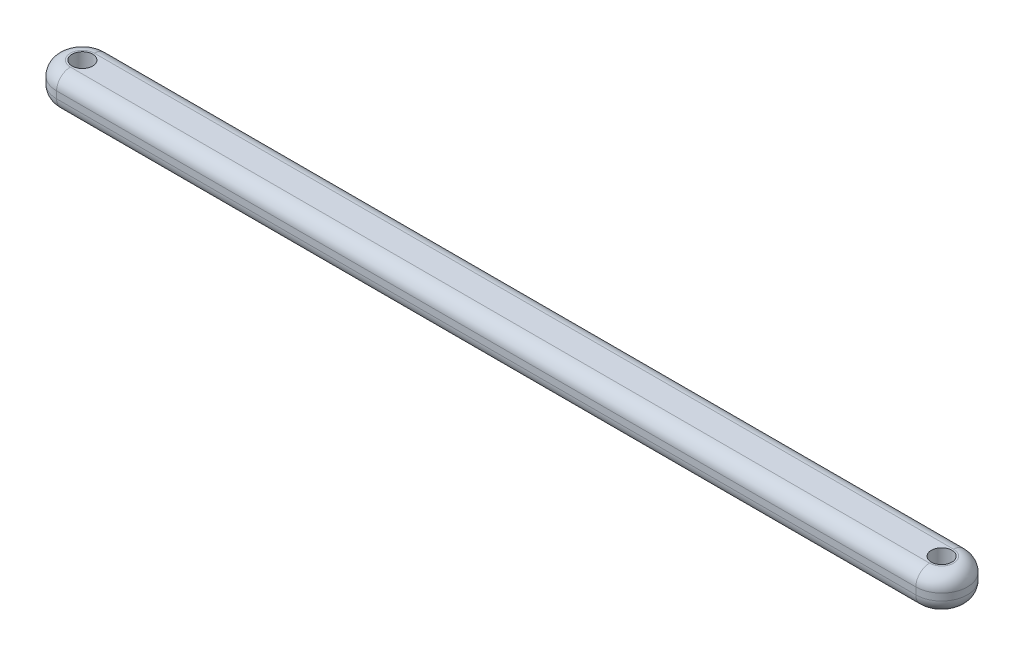
ISO-10303-21;
HEADER;
FILE_DESCRIPTION(('STEP AP214'),'2;1');
FILE_NAME('part.step','',(''),(''),'','','');
FILE_SCHEMA(('AUTOMOTIVE_DESIGN { 1 0 10303 214 1 1 1 1 }'));
ENDSEC;
DATA;
#1=APPLICATION_CONTEXT('core data for automotive mechanical design processes');
#2=APPLICATION_PROTOCOL_DEFINITION('international standard','automotive_design',2000,#1);
#3=PRODUCT_CONTEXT('',#1,'mechanical');
#4=PRODUCT('Part','Part','',(#3));
#5=PRODUCT_RELATED_PRODUCT_CATEGORY('part','',(#4));
#6=PRODUCT_DEFINITION_FORMATION('','',#4);
#7=PRODUCT_DEFINITION_CONTEXT('part definition',#1,'design');
#8=PRODUCT_DEFINITION('design','',#6,#7);
#9=PRODUCT_DEFINITION_SHAPE('','',#8);
#10=(LENGTH_UNIT() NAMED_UNIT(*) SI_UNIT(.MILLI.,.METRE.));
#11=(NAMED_UNIT(*) PLANE_ANGLE_UNIT() SI_UNIT($,.RADIAN.));
#12=(NAMED_UNIT(*) SI_UNIT($,.STERADIAN.) SOLID_ANGLE_UNIT());
#13=UNCERTAINTY_MEASURE_WITH_UNIT(LENGTH_MEASURE(1.E-05),#10,'distance_accuracy_value','');
#14=(GEOMETRIC_REPRESENTATION_CONTEXT(3) GLOBAL_UNCERTAINTY_ASSIGNED_CONTEXT((#13)) GLOBAL_UNIT_ASSIGNED_CONTEXT((#10,
#11,#12)) REPRESENTATION_CONTEXT('',''));
#15=CARTESIAN_POINT('',(0.,0.,0.));
#16=DIRECTION('',(0.,0.,1.));
#17=DIRECTION('',(1.,0.,0.));
#18=AXIS2_PLACEMENT_3D('',#15,#16,#17);
#19=CARTESIAN_POINT('',(-250.,5.,0.));
#20=DIRECTION('',(0.,1.,0.));
#21=DIRECTION('',(0.,0.,1.));
#22=AXIS2_PLACEMENT_3D('',#19,#20,#21);
#23=PLANE('',#22);
#24=DIRECTION('',(1.,0.,0.));
#25=VECTOR('',#24,1.);
#26=CARTESIAN_POINT('',(0.,5.,3.5));
#27=LINE('',#26,#25);
#28=CARTESIAN_POINT('',(-250.,5.,3.5));
#29=VERTEX_POINT('',#28);
#30=CARTESIAN_POINT('',(0.,5.,3.5));
#31=VERTEX_POINT('',#30);
#32=EDGE_CURVE('E131',#29,#31,#27,.T.);
#33=ORIENTED_EDGE('',*,*,#32,.T.);
#34=CARTESIAN_POINT('',(0.,5.,0.));
#35=DIRECTION('',(0.,1.,0.));
#36=DIRECTION('',(0.,0.,1.));
#37=AXIS2_PLACEMENT_3D('',#34,#35,#36);
#38=CIRCLE('',#37,3.5);
#39=CARTESIAN_POINT('',(0.,5.,-3.5));
#40=VERTEX_POINT('',#39);
#41=EDGE_CURVE('E112',#31,#40,#38,.T.);
#42=ORIENTED_EDGE('',*,*,#41,.T.);
#43=DIRECTION('',(-1.,0.,0.));
#44=VECTOR('',#43,1.);
#45=CARTESIAN_POINT('',(-250.,5.,-3.5));
#46=LINE('',#45,#44);
#47=CARTESIAN_POINT('',(-250.,5.,-3.5));
#48=VERTEX_POINT('',#47);
#49=EDGE_CURVE('E120',#40,#48,#46,.T.);
#50=ORIENTED_EDGE('',*,*,#49,.T.);
#51=CARTESIAN_POINT('',(-250.,5.,0.));
#52=DIRECTION('',(0.,1.,0.));
#53=DIRECTION('',(0.,0.,1.));
#54=AXIS2_PLACEMENT_3D('',#51,#52,#53);
#55=CIRCLE('',#54,3.5);
#56=EDGE_CURVE('E126',#48,#29,#55,.T.);
#57=ORIENTED_EDGE('',*,*,#56,.T.);
#58=EDGE_LOOP('',(#33,#42,#50,#57));
#59=FACE_BOUND('',#58,.T.);
#60=CARTESIAN_POINT('',(0.,5.,0.));
#61=DIRECTION('',(0.,1.,0.));
#62=DIRECTION('',(0.,0.,1.));
#63=AXIS2_PLACEMENT_3D('',#60,#61,#62);
#64=CIRCLE('',#63,3.);
#65=CARTESIAN_POINT('',(0.,5.,3.));
#66=VERTEX_POINT('',#65);
#67=EDGE_CURVE('E198',#66,#66,#64,.T.);
#68=ORIENTED_EDGE('',*,*,#67,.F.);
#69=EDGE_LOOP('',(#68));
#70=FACE_BOUND('',#69,.T.);
#71=CARTESIAN_POINT('',(-250.,5.,0.));
#72=DIRECTION('',(0.,1.,0.));
#73=DIRECTION('',(0.,0.,1.));
#74=AXIS2_PLACEMENT_3D('',#71,#72,#73);
#75=CIRCLE('',#74,2.99999999999999);
#76=CARTESIAN_POINT('',(-250.,5.,2.99999999999999));
#77=VERTEX_POINT('',#76);
#78=EDGE_CURVE('E351',#77,#77,#75,.T.);
#79=ORIENTED_EDGE('',*,*,#78,.F.);
#80=EDGE_LOOP('',(#79));
#81=FACE_BOUND('',#80,.T.);
#82=ADVANCED_FACE('F39',(#59,#70,#81),#23,.T.);
#83=CARTESIAN_POINT('',(-250.,-5.,0.));
#84=DIRECTION('',(0.,1.,0.));
#85=DIRECTION('',(0.,0.,1.));
#86=AXIS2_PLACEMENT_3D('',#83,#84,#85);
#87=PLANE('',#86);
#88=DIRECTION('',(-1.,0.,0.));
#89=VECTOR('',#88,1.);
#90=CARTESIAN_POINT('',(-250.,-5.,-3.5));
#91=LINE('',#90,#89);
#92=CARTESIAN_POINT('',(-250.,-5.,-3.5));
#93=VERTEX_POINT('',#92);
#94=CARTESIAN_POINT('',(0.,-5.,-3.5));
#95=VERTEX_POINT('',#94);
#96=EDGE_CURVE('E149',#93,#95,#91,.F.);
#97=ORIENTED_EDGE('',*,*,#96,.T.);
#98=CARTESIAN_POINT('',(0.,-5.,0.));
#99=DIRECTION('',(0.,1.,0.));
#100=DIRECTION('',(0.,0.,1.));
#101=AXIS2_PLACEMENT_3D('',#98,#99,#100);
#102=CIRCLE('',#101,3.5);
#103=CARTESIAN_POINT('',(0.,-5.,3.5));
#104=VERTEX_POINT('',#103);
#105=EDGE_CURVE('E154',#95,#104,#102,.F.);
#106=ORIENTED_EDGE('',*,*,#105,.T.);
#107=DIRECTION('',(1.,0.,0.));
#108=VECTOR('',#107,1.);
#109=CARTESIAN_POINT('',(-250.,-5.,3.5));
#110=LINE('',#109,#108);
#111=CARTESIAN_POINT('',(-250.,-5.,3.5));
#112=VERTEX_POINT('',#111);
#113=EDGE_CURVE('E63',#104,#112,#110,.F.);
#114=ORIENTED_EDGE('',*,*,#113,.T.);
#115=CARTESIAN_POINT('',(-250.,-5.,0.));
#116=DIRECTION('',(0.,1.,0.));
#117=DIRECTION('',(0.,0.,1.));
#118=AXIS2_PLACEMENT_3D('',#115,#116,#117);
#119=CIRCLE('',#118,3.5);
#120=EDGE_CURVE('E151',#112,#93,#119,.F.);
#121=ORIENTED_EDGE('',*,*,#120,.T.);
#122=EDGE_LOOP('',(#97,#106,#114,#121));
#123=FACE_BOUND('',#122,.T.);
#124=CARTESIAN_POINT('',(0.,-5.,0.));
#125=DIRECTION('',(0.,1.,0.));
#126=DIRECTION('',(0.,0.,1.));
#127=AXIS2_PLACEMENT_3D('',#124,#125,#126);
#128=CIRCLE('',#127,3.);
#129=CARTESIAN_POINT('',(0.,-5.,3.));
#130=VERTEX_POINT('',#129);
#131=EDGE_CURVE('E350',#130,#130,#128,.T.);
#132=ORIENTED_EDGE('',*,*,#131,.T.);
#133=EDGE_LOOP('',(#132));
#134=FACE_BOUND('',#133,.T.);
#135=CARTESIAN_POINT('',(-250.,-5.,0.));
#136=DIRECTION('',(0.,1.,0.));
#137=DIRECTION('',(0.,0.,1.));
#138=AXIS2_PLACEMENT_3D('',#135,#136,#137);
#139=CIRCLE('',#138,2.99999999999999);
#140=CARTESIAN_POINT('',(-250.,-5.,2.99999999999999));
#141=VERTEX_POINT('',#140);
#142=EDGE_CURVE('E162',#141,#141,#139,.T.);
#143=ORIENTED_EDGE('',*,*,#142,.T.);
#144=EDGE_LOOP('',(#143));
#145=FACE_BOUND('',#144,.T.);
#146=ADVANCED_FACE('F178',(#123,#134,#145),#87,.F.);
#147=CARTESIAN_POINT('',(-250.,5.,0.));
#148=DIRECTION('',(0.,-1.,0.));
#149=DIRECTION('',(0.,0.,-1.));
#150=AXIS2_PLACEMENT_3D('',#147,#148,#149);
#151=CYLINDRICAL_SURFACE('',#150,7.5);
#152=DIRECTION('',(0.,-1.,0.));
#153=VECTOR('',#152,1.);
#154=CARTESIAN_POINT('',(-250.,5.,7.5));
#155=LINE('',#154,#153);
#156=CARTESIAN_POINT('',(-250.,1.,7.5));
#157=VERTEX_POINT('',#156);
#158=CARTESIAN_POINT('',(-250.,-1.,7.5));
#159=VERTEX_POINT('',#158);
#160=EDGE_CURVE('E127',#157,#159,#155,.T.);
#161=ORIENTED_EDGE('',*,*,#160,.F.);
#162=CARTESIAN_POINT('',(-250.,1.,0.));
#163=DIRECTION('',(0.,1.,0.));
#164=DIRECTION('',(0.,0.,1.));
#165=AXIS2_PLACEMENT_3D('',#162,#163,#164);
#166=CIRCLE('',#165,7.5);
#167=CARTESIAN_POINT('',(-250.,1.,-7.5));
#168=VERTEX_POINT('',#167);
#169=EDGE_CURVE('E147',#157,#168,#166,.F.);
#170=ORIENTED_EDGE('',*,*,#169,.T.);
#171=DIRECTION('',(0.,-1.,0.));
#172=VECTOR('',#171,1.);
#173=CARTESIAN_POINT('',(-250.,5.,-7.5));
#174=LINE('',#173,#172);
#175=CARTESIAN_POINT('',(-250.,-1.,-7.5));
#176=VERTEX_POINT('',#175);
#177=EDGE_CURVE('E195',#168,#176,#174,.T.);
#178=ORIENTED_EDGE('',*,*,#177,.T.);
#179=CARTESIAN_POINT('',(-250.,-1.,0.));
#180=DIRECTION('',(0.,1.,0.));
#181=DIRECTION('',(0.,0.,1.));
#182=AXIS2_PLACEMENT_3D('',#179,#180,#181);
#183=CIRCLE('',#182,7.5);
#184=EDGE_CURVE('E145',#176,#159,#183,.T.);
#185=ORIENTED_EDGE('',*,*,#184,.T.);
#186=EDGE_LOOP('',(#161,#170,#178,#185));
#187=FACE_BOUND('',#186,.T.);
#188=ADVANCED_FACE('F214',(#187),#151,.T.);
#189=CARTESIAN_POINT('',(-250.,5.,7.5));
#190=DIRECTION('',(0.,0.,-1.));
#191=DIRECTION('',(-1.,0.,0.));
#192=AXIS2_PLACEMENT_3D('',#189,#190,#191);
#193=PLANE('',#192);
#194=DIRECTION('',(0.,-1.,0.));
#195=VECTOR('',#194,1.);
#196=CARTESIAN_POINT('',(0.,5.,7.5));
#197=LINE('',#196,#195);
#198=CARTESIAN_POINT('',(0.,1.,7.5));
#199=VERTEX_POINT('',#198);
#200=CARTESIAN_POINT('',(0.,-1.,7.5));
#201=VERTEX_POINT('',#200);
#202=EDGE_CURVE('E193',#199,#201,#197,.T.);
#203=ORIENTED_EDGE('',*,*,#202,.F.);
#204=DIRECTION('',(1.,0.,0.));
#205=VECTOR('',#204,1.);
#206=CARTESIAN_POINT('',(-250.,1.,7.5));
#207=LINE('',#206,#205);
#208=EDGE_CURVE('E143',#199,#157,#207,.F.);
#209=ORIENTED_EDGE('',*,*,#208,.T.);
#210=ORIENTED_EDGE('',*,*,#160,.T.);
#211=DIRECTION('',(1.,0.,0.));
#212=VECTOR('',#211,1.);
#213=CARTESIAN_POINT('',(-250.,-1.,7.5));
#214=LINE('',#213,#212);
#215=EDGE_CURVE('E141',#159,#201,#214,.T.);
#216=ORIENTED_EDGE('',*,*,#215,.T.);
#217=EDGE_LOOP('',(#203,#209,#210,#216));
#218=FACE_BOUND('',#217,.T.);
#219=ADVANCED_FACE('F212',(#218),#193,.F.);
#220=CARTESIAN_POINT('',(0.,5.,0.));
#221=DIRECTION('',(0.,-1.,0.));
#222=DIRECTION('',(0.,0.,-1.));
#223=AXIS2_PLACEMENT_3D('',#220,#221,#222);
#224=CYLINDRICAL_SURFACE('',#223,7.5);
#225=DIRECTION('',(0.,-1.,0.));
#226=VECTOR('',#225,1.);
#227=CARTESIAN_POINT('',(0.,5.,-7.5));
#228=LINE('',#227,#226);
#229=CARTESIAN_POINT('',(0.,1.,-7.5));
#230=VERTEX_POINT('',#229);
#231=CARTESIAN_POINT('',(0.,-1.,-7.5));
#232=VERTEX_POINT('',#231);
#233=EDGE_CURVE('E191',#230,#232,#228,.T.);
#234=ORIENTED_EDGE('',*,*,#233,.F.);
#235=CARTESIAN_POINT('',(0.,1.,0.));
#236=DIRECTION('',(0.,1.,0.));
#237=DIRECTION('',(0.,0.,1.));
#238=AXIS2_PLACEMENT_3D('',#235,#236,#237);
#239=CIRCLE('',#238,7.5);
#240=EDGE_CURVE('E114',#230,#199,#239,.F.);
#241=ORIENTED_EDGE('',*,*,#240,.T.);
#242=ORIENTED_EDGE('',*,*,#202,.T.);
#243=CARTESIAN_POINT('',(0.,-1.,0.));
#244=DIRECTION('',(0.,1.,0.));
#245=DIRECTION('',(0.,0.,1.));
#246=AXIS2_PLACEMENT_3D('',#243,#244,#245);
#247=CIRCLE('',#246,7.5);
#248=EDGE_CURVE('E133',#201,#232,#247,.T.);
#249=ORIENTED_EDGE('',*,*,#248,.T.);
#250=EDGE_LOOP('',(#234,#241,#242,#249));
#251=FACE_BOUND('',#250,.T.);
#252=ADVANCED_FACE('F190',(#251),#224,.T.);
#253=CARTESIAN_POINT('',(0.,5.,-7.5));
#254=DIRECTION('',(0.,0.,1.));
#255=DIRECTION('',(1.,0.,0.));
#256=AXIS2_PLACEMENT_3D('',#253,#254,#255);
#257=PLANE('',#256);
#258=ORIENTED_EDGE('',*,*,#177,.F.);
#259=DIRECTION('',(-1.,0.,0.));
#260=VECTOR('',#259,1.);
#261=CARTESIAN_POINT('',(0.,1.,-7.5));
#262=LINE('',#261,#260);
#263=EDGE_CURVE('E11',#168,#230,#262,.F.);
#264=ORIENTED_EDGE('',*,*,#263,.T.);
#265=ORIENTED_EDGE('',*,*,#233,.T.);
#266=DIRECTION('',(-1.,0.,0.));
#267=VECTOR('',#266,1.);
#268=CARTESIAN_POINT('',(0.,-1.,-7.5));
#269=LINE('',#268,#267);
#270=EDGE_CURVE('E48',#232,#176,#269,.T.);
#271=ORIENTED_EDGE('',*,*,#270,.T.);
#272=EDGE_LOOP('',(#258,#264,#265,#271));
#273=FACE_BOUND('',#272,.T.);
#274=ADVANCED_FACE('F194',(#273),#257,.F.);
#275=CARTESIAN_POINT('',(0.,5.,0.));
#276=DIRECTION('',(0.,-1.,0.));
#277=DIRECTION('',(0.,0.,-1.));
#278=AXIS2_PLACEMENT_3D('',#275,#276,#277);
#279=CYLINDRICAL_SURFACE('',#278,3.);
#280=ORIENTED_EDGE('',*,*,#67,.T.);
#281=EDGE_LOOP('',(#280));
#282=FACE_BOUND('',#281,.T.);
#283=ORIENTED_EDGE('',*,*,#131,.F.);
#284=EDGE_LOOP('',(#283));
#285=FACE_BOUND('',#284,.T.);
#286=ADVANCED_FACE('F230',(#282,#285),#279,.F.);
#287=CARTESIAN_POINT('',(-250.,5.,0.));
#288=DIRECTION('',(0.,-1.,0.));
#289=DIRECTION('',(0.,0.,-1.));
#290=AXIS2_PLACEMENT_3D('',#287,#288,#289);
#291=CYLINDRICAL_SURFACE('',#290,2.99999999999999);
#292=ORIENTED_EDGE('',*,*,#78,.T.);
#293=EDGE_LOOP('',(#292));
#294=FACE_BOUND('',#293,.T.);
#295=ORIENTED_EDGE('',*,*,#142,.F.);
#296=EDGE_LOOP('',(#295));
#297=FACE_BOUND('',#296,.T.);
#298=ADVANCED_FACE('F253',(#294,#297),#291,.F.);
#299=CARTESIAN_POINT('',(-250.,1.,0.));
#300=DIRECTION('',(0.,1.,0.));
#301=DIRECTION('',(0.,0.,1.));
#302=AXIS2_PLACEMENT_3D('',#299,#300,#301);
#303=DEGENERATE_TOROIDAL_SURFACE('',#302,3.5,4.,.T.);
#304=CARTESIAN_POINT('',(-250.,1.,-3.5));
#305=DIRECTION('',(1.,0.,0.));
#306=DIRECTION('',(0.,0.,-1.));
#307=AXIS2_PLACEMENT_3D('',#304,#305,#306);
#308=CIRCLE('',#307,4.);
#309=EDGE_CURVE('E123',#168,#48,#308,.T.);
#310=ORIENTED_EDGE('',*,*,#309,.F.);
#311=ORIENTED_EDGE('',*,*,#169,.F.);
#312=CARTESIAN_POINT('',(-250.,1.,3.5));
#313=DIRECTION('',(1.,0.,0.));
#314=DIRECTION('',(0.,0.,-1.));
#315=AXIS2_PLACEMENT_3D('',#312,#313,#314);
#316=CIRCLE('',#315,4.);
#317=EDGE_CURVE('E159',#29,#157,#316,.T.);
#318=ORIENTED_EDGE('',*,*,#317,.F.);
#319=ORIENTED_EDGE('',*,*,#56,.F.);
#320=EDGE_LOOP('',(#310,#311,#318,#319));
#321=FACE_BOUND('',#320,.T.);
#322=ADVANCED_FACE('F206',(#321),#303,.T.);
#323=CARTESIAN_POINT('',(-250.,1.,3.5));
#324=DIRECTION('',(-1.,0.,0.));
#325=DIRECTION('',(0.,0.,1.));
#326=AXIS2_PLACEMENT_3D('',#323,#324,#325);
#327=CYLINDRICAL_SURFACE('',#326,4.);
#328=ORIENTED_EDGE('',*,*,#317,.T.);
#329=ORIENTED_EDGE('',*,*,#208,.F.);
#330=CARTESIAN_POINT('',(0.,1.,3.5));
#331=DIRECTION('',(1.,0.,0.));
#332=DIRECTION('',(0.,0.,-1.));
#333=AXIS2_PLACEMENT_3D('',#330,#331,#332);
#334=CIRCLE('',#333,4.);
#335=EDGE_CURVE('E117',#31,#199,#334,.T.);
#336=ORIENTED_EDGE('',*,*,#335,.F.);
#337=ORIENTED_EDGE('',*,*,#32,.F.);
#338=EDGE_LOOP('',(#328,#329,#336,#337));
#339=FACE_BOUND('',#338,.T.);
#340=ADVANCED_FACE('F209',(#339),#327,.T.);
#341=CARTESIAN_POINT('',(-250.,1.,-3.5));
#342=DIRECTION('',(1.,0.,0.));
#343=DIRECTION('',(0.,0.,-1.));
#344=AXIS2_PLACEMENT_3D('',#341,#342,#343);
#345=CYLINDRICAL_SURFACE('',#344,4.);
#346=ORIENTED_EDGE('',*,*,#309,.T.);
#347=ORIENTED_EDGE('',*,*,#49,.F.);
#348=CARTESIAN_POINT('',(0.,1.,-3.5));
#349=DIRECTION('',(1.,0.,0.));
#350=DIRECTION('',(0.,0.,-1.));
#351=AXIS2_PLACEMENT_3D('',#348,#349,#350);
#352=CIRCLE('',#351,4.);
#353=EDGE_CURVE('E108',#230,#40,#352,.T.);
#354=ORIENTED_EDGE('',*,*,#353,.F.);
#355=ORIENTED_EDGE('',*,*,#263,.F.);
#356=EDGE_LOOP('',(#346,#347,#354,#355));
#357=FACE_BOUND('',#356,.T.);
#358=ADVANCED_FACE('F121',(#357),#345,.T.);
#359=CARTESIAN_POINT('',(0.,1.,0.));
#360=DIRECTION('',(0.,1.,0.));
#361=DIRECTION('',(0.,0.,1.));
#362=AXIS2_PLACEMENT_3D('',#359,#360,#361);
#363=DEGENERATE_TOROIDAL_SURFACE('',#362,3.5,4.,.T.);
#364=ORIENTED_EDGE('',*,*,#335,.T.);
#365=ORIENTED_EDGE('',*,*,#240,.F.);
#366=ORIENTED_EDGE('',*,*,#353,.T.);
#367=ORIENTED_EDGE('',*,*,#41,.F.);
#368=EDGE_LOOP('',(#364,#365,#366,#367));
#369=FACE_BOUND('',#368,.T.);
#370=ADVANCED_FACE('F110',(#369),#363,.T.);
#371=CARTESIAN_POINT('',(-250.,-1.,0.));
#372=DIRECTION('',(0.,1.,0.));
#373=DIRECTION('',(0.,0.,1.));
#374=AXIS2_PLACEMENT_3D('',#371,#372,#373);
#375=DEGENERATE_TOROIDAL_SURFACE('',#374,3.5,4.,.T.);
#376=CARTESIAN_POINT('',(-250.,-1.,-3.5));
#377=DIRECTION('',(1.,0.,0.));
#378=DIRECTION('',(0.,0.,-1.));
#379=AXIS2_PLACEMENT_3D('',#376,#377,#378);
#380=CIRCLE('',#379,4.);
#381=EDGE_CURVE('E165',#93,#176,#380,.T.);
#382=ORIENTED_EDGE('',*,*,#381,.F.);
#383=ORIENTED_EDGE('',*,*,#120,.F.);
#384=CARTESIAN_POINT('',(-250.,-1.,3.5));
#385=DIRECTION('',(1.,0.,0.));
#386=DIRECTION('',(0.,0.,-1.));
#387=AXIS2_PLACEMENT_3D('',#384,#385,#386);
#388=CIRCLE('',#387,4.);
#389=EDGE_CURVE('E43',#159,#112,#388,.T.);
#390=ORIENTED_EDGE('',*,*,#389,.F.);
#391=ORIENTED_EDGE('',*,*,#184,.F.);
#392=EDGE_LOOP('',(#382,#383,#390,#391));
#393=FACE_BOUND('',#392,.T.);
#394=ADVANCED_FACE('F41',(#393),#375,.T.);
#395=CARTESIAN_POINT('',(-250.,-1.,3.5));
#396=DIRECTION('',(1.,0.,0.));
#397=DIRECTION('',(0.,0.,-1.));
#398=AXIS2_PLACEMENT_3D('',#395,#396,#397);
#399=CYLINDRICAL_SURFACE('',#398,4.);
#400=ORIENTED_EDGE('',*,*,#389,.T.);
#401=ORIENTED_EDGE('',*,*,#113,.F.);
#402=CARTESIAN_POINT('',(0.,-1.,3.5));
#403=DIRECTION('',(1.,0.,0.));
#404=DIRECTION('',(0.,1.,0.));
#405=AXIS2_PLACEMENT_3D('',#402,#403,#404);
#406=CIRCLE('',#405,4.);
#407=EDGE_CURVE('E56',#201,#104,#406,.T.);
#408=ORIENTED_EDGE('',*,*,#407,.F.);
#409=ORIENTED_EDGE('',*,*,#215,.F.);
#410=EDGE_LOOP('',(#400,#401,#408,#409));
#411=FACE_BOUND('',#410,.T.);
#412=ADVANCED_FACE('F175',(#411),#399,.T.);
#413=CARTESIAN_POINT('',(0.,-1.,-3.5));
#414=DIRECTION('',(-1.,0.,0.));
#415=DIRECTION('',(0.,0.,1.));
#416=AXIS2_PLACEMENT_3D('',#413,#414,#415);
#417=CYLINDRICAL_SURFACE('',#416,4.);
#418=ORIENTED_EDGE('',*,*,#381,.T.);
#419=ORIENTED_EDGE('',*,*,#270,.F.);
#420=CARTESIAN_POINT('',(0.,-1.,-3.5));
#421=DIRECTION('',(1.,0.,0.));
#422=DIRECTION('',(0.,0.,-1.));
#423=AXIS2_PLACEMENT_3D('',#420,#421,#422);
#424=CIRCLE('',#423,4.);
#425=EDGE_CURVE('E163',#95,#232,#424,.T.);
#426=ORIENTED_EDGE('',*,*,#425,.F.);
#427=ORIENTED_EDGE('',*,*,#96,.F.);
#428=EDGE_LOOP('',(#418,#419,#426,#427));
#429=FACE_BOUND('',#428,.T.);
#430=ADVANCED_FACE('F182',(#429),#417,.T.);
#431=CARTESIAN_POINT('',(0.,-1.,0.));
#432=DIRECTION('',(0.,1.,0.));
#433=DIRECTION('',(0.,0.,1.));
#434=AXIS2_PLACEMENT_3D('',#431,#432,#433);
#435=DEGENERATE_TOROIDAL_SURFACE('',#434,3.5,4.,.T.);
#436=ORIENTED_EDGE('',*,*,#407,.T.);
#437=ORIENTED_EDGE('',*,*,#105,.F.);
#438=ORIENTED_EDGE('',*,*,#425,.T.);
#439=ORIENTED_EDGE('',*,*,#248,.F.);
#440=EDGE_LOOP('',(#436,#437,#438,#439));
#441=FACE_BOUND('',#440,.T.);
#442=ADVANCED_FACE('F181',(#441),#435,.T.);
#443=CLOSED_SHELL('',(#82,#146,#188,#219,#252,#274,#286,#298,#322,#340,#358,#370,#394,#412,#430,#442));
#444=MANIFOLD_SOLID_BREP('B2',#443);
#445=ADVANCED_BREP_SHAPE_REPRESENTATION('',(#18,#444),#14);
#446=SHAPE_DEFINITION_REPRESENTATION(#9,#445);
ENDSEC;
END-ISO-10303-21;
